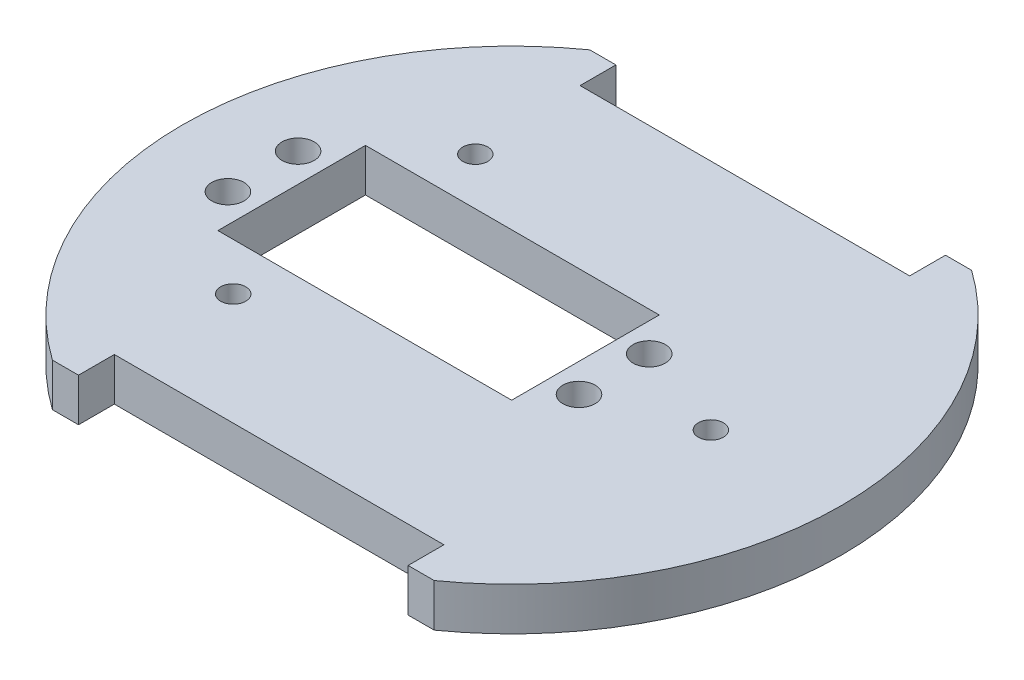
ISO-10303-21;
HEADER;
FILE_DESCRIPTION(('STEP AP214'),'2;1');
FILE_NAME('part.step','',(''),(''),'','','');
FILE_SCHEMA(('AUTOMOTIVE_DESIGN { 1 0 10303 214 1 1 1 1 }'));
ENDSEC;
DATA;
#1=APPLICATION_CONTEXT('core data for automotive mechanical design processes');
#2=APPLICATION_PROTOCOL_DEFINITION('international standard','automotive_design',2000,#1);
#3=PRODUCT_CONTEXT('',#1,'mechanical');
#4=PRODUCT('Part','Part','',(#3));
#5=PRODUCT_RELATED_PRODUCT_CATEGORY('part','',(#4));
#6=PRODUCT_DEFINITION_FORMATION('','',#4);
#7=PRODUCT_DEFINITION_CONTEXT('part definition',#1,'design');
#8=PRODUCT_DEFINITION('design','',#6,#7);
#9=PRODUCT_DEFINITION_SHAPE('','',#8);
#10=(LENGTH_UNIT() NAMED_UNIT(*) SI_UNIT(.MILLI.,.METRE.));
#11=(NAMED_UNIT(*) PLANE_ANGLE_UNIT() SI_UNIT($,.RADIAN.));
#12=(NAMED_UNIT(*) SI_UNIT($,.STERADIAN.) SOLID_ANGLE_UNIT());
#13=UNCERTAINTY_MEASURE_WITH_UNIT(LENGTH_MEASURE(1.E-05),#10,'distance_accuracy_value','');
#14=(GEOMETRIC_REPRESENTATION_CONTEXT(3) GLOBAL_UNCERTAINTY_ASSIGNED_CONTEXT((#13)) GLOBAL_UNIT_ASSIGNED_CONTEXT((#10,
#11,#12)) REPRESENTATION_CONTEXT('',''));
#15=CARTESIAN_POINT('',(0.,0.,0.));
#16=DIRECTION('',(0.,0.,1.));
#17=DIRECTION('',(1.,0.,0.));
#18=AXIS2_PLACEMENT_3D('',#15,#16,#17);
#19=CARTESIAN_POINT('',(0.,6.,0.));
#20=DIRECTION('',(0.,1.,0.));
#21=DIRECTION('',(0.,0.,1.));
#22=AXIS2_PLACEMENT_3D('',#19,#20,#21);
#23=PLANE('',#22);
#24=CARTESIAN_POINT('',(-34.75,6.,4.9));
#25=DIRECTION('',(0.,1.,0.));
#26=DIRECTION('',(0.,0.,-1.));
#27=AXIS2_PLACEMENT_3D('',#24,#25,#26);
#28=CIRCLE('',#27,2.25);
#29=CARTESIAN_POINT('',(-34.75,6.,2.65));
#30=VERTEX_POINT('',#29);
#31=EDGE_CURVE('E555',#30,#30,#28,.T.);
#32=ORIENTED_EDGE('',*,*,#31,.F.);
#33=EDGE_LOOP('',(#32));
#34=FACE_BOUND('',#33,.T.);
#35=CARTESIAN_POINT('',(-22.0155551930817,6.,-16.893129654992));
#36=DIRECTION('',(0.,1.,0.));
#37=DIRECTION('',(0.,0.,1.));
#38=AXIS2_PLACEMENT_3D('',#35,#36,#37);
#39=CIRCLE('',#38,1.75);
#40=CARTESIAN_POINT('',(-22.0155551930817,6.,-15.143129654992));
#41=VERTEX_POINT('',#40);
#42=EDGE_CURVE('E567',#41,#41,#39,.T.);
#43=ORIENTED_EDGE('',*,*,#42,.F.);
#44=EDGE_LOOP('',(#43));
#45=FACE_BOUND('',#44,.T.);
#46=CARTESIAN_POINT('',(14.25,6.,4.9));
#47=DIRECTION('',(0.,1.,0.));
#48=DIRECTION('',(0.,0.,1.));
#49=AXIS2_PLACEMENT_3D('',#46,#47,#48);
#50=CIRCLE('',#49,2.25);
#51=CARTESIAN_POINT('',(14.25,6.,7.15));
#52=VERTEX_POINT('',#51);
#53=EDGE_CURVE('E579',#52,#52,#50,.T.);
#54=ORIENTED_EDGE('',*,*,#53,.F.);
#55=EDGE_LOOP('',(#54));
#56=FACE_BOUND('',#55,.T.);
#57=DIRECTION('',(-1.,0.,0.));
#58=VECTOR('',#57,1.);
#59=CARTESIAN_POINT('',(-30.75,6.,-10.3));
#60=LINE('',#59,#58);
#61=CARTESIAN_POINT('',(10.25,6.,-10.3));
#62=VERTEX_POINT('',#61);
#63=CARTESIAN_POINT('',(-30.75,6.,-10.3));
#64=VERTEX_POINT('',#63);
#65=EDGE_CURVE('E154',#62,#64,#60,.T.);
#66=ORIENTED_EDGE('',*,*,#65,.F.);
#67=DIRECTION('',(0.,0.,-1.));
#68=VECTOR('',#67,1.);
#69=CARTESIAN_POINT('',(10.25,6.,10.3));
#70=LINE('',#69,#68);
#71=CARTESIAN_POINT('',(10.25,6.,10.3));
#72=VERTEX_POINT('',#71);
#73=EDGE_CURVE('E146',#72,#62,#70,.T.);
#74=ORIENTED_EDGE('',*,*,#73,.F.);
#75=DIRECTION('',(1.,0.,0.));
#76=VECTOR('',#75,1.);
#77=CARTESIAN_POINT('',(-30.75,6.,10.3));
#78=LINE('',#77,#76);
#79=CARTESIAN_POINT('',(-30.75,6.,10.3));
#80=VERTEX_POINT('',#79);
#81=EDGE_CURVE('E169',#80,#72,#78,.T.);
#82=ORIENTED_EDGE('',*,*,#81,.F.);
#83=DIRECTION('',(0.,0.,1.));
#84=VECTOR('',#83,1.);
#85=CARTESIAN_POINT('',(-30.75,6.,10.3));
#86=LINE('',#85,#84);
#87=EDGE_CURVE('E167',#64,#80,#86,.T.);
#88=ORIENTED_EDGE('',*,*,#87,.F.);
#89=EDGE_LOOP('',(#66,#74,#82,#88));
#90=FACE_BOUND('',#89,.T.);
#91=DIRECTION('',(-1.94289029309378E-13,0.,1.));
#92=VECTOR('',#91,1.);
#93=CARTESIAN_POINT('',(23.0000000000005,6.,32.4999999999997));
#94=LINE('',#93,#92);
#95=CARTESIAN_POINT('',(23.0000000000005,6.,32.4999999999997));
#96=VERTEX_POINT('',#95);
#97=CARTESIAN_POINT('',(22.9999999999995,6.,37.5000000000003));
#98=VERTEX_POINT('',#97);
#99=EDGE_CURVE('E185',#96,#98,#94,.T.);
#100=ORIENTED_EDGE('',*,*,#99,.T.);
#101=DIRECTION('',(1.,0.,0.));
#102=VECTOR('',#101,1.);
#103=CARTESIAN_POINT('',(22.9999999999995,6.,37.5000000000003));
#104=LINE('',#103,#102);
#105=CARTESIAN_POINT('',(26.6411336095139,6.,37.5000000000004));
#106=VERTEX_POINT('',#105);
#107=EDGE_CURVE('E188',#98,#106,#104,.T.);
#108=ORIENTED_EDGE('',*,*,#107,.T.);
#109=CARTESIAN_POINT('',(0.,6.,0.));
#110=DIRECTION('',(0.,1.,0.));
#111=DIRECTION('',(0.,0.,1.));
#112=AXIS2_PLACEMENT_3D('',#109,#110,#111);
#113=CIRCLE('',#112,46.);
#114=CARTESIAN_POINT('',(26.6411336095145,6.,-37.5));
#115=VERTEX_POINT('',#114);
#116=EDGE_CURVE('E191',#106,#115,#113,.T.);
#117=ORIENTED_EDGE('',*,*,#116,.T.);
#118=DIRECTION('',(-1.,0.,0.));
#119=VECTOR('',#118,1.);
#120=CARTESIAN_POINT('',(23.,6.,-37.5));
#121=LINE('',#120,#119);
#122=CARTESIAN_POINT('',(23.,6.,-37.5));
#123=VERTEX_POINT('',#122);
#124=EDGE_CURVE('E193',#115,#123,#121,.T.);
#125=ORIENTED_EDGE('',*,*,#124,.T.);
#126=DIRECTION('',(0.,0.,1.));
#127=VECTOR('',#126,1.);
#128=CARTESIAN_POINT('',(23.,6.,-32.5));
#129=LINE('',#128,#127);
#130=CARTESIAN_POINT('',(23.,6.,-32.5));
#131=VERTEX_POINT('',#130);
#132=EDGE_CURVE('E195',#123,#131,#129,.T.);
#133=ORIENTED_EDGE('',*,*,#132,.T.);
#134=DIRECTION('',(-1.,0.,0.));
#135=VECTOR('',#134,1.);
#136=CARTESIAN_POINT('',(-23.,6.,-32.5));
#137=LINE('',#136,#135);
#138=CARTESIAN_POINT('',(-23.,6.,-32.5));
#139=VERTEX_POINT('',#138);
#140=EDGE_CURVE('E197',#131,#139,#137,.T.);
#141=ORIENTED_EDGE('',*,*,#140,.T.);
#142=DIRECTION('',(0.,0.,-1.));
#143=VECTOR('',#142,1.);
#144=CARTESIAN_POINT('',(-23.,6.,-32.5));
#145=LINE('',#144,#143);
#146=CARTESIAN_POINT('',(-23.,6.,-37.5));
#147=VERTEX_POINT('',#146);
#148=EDGE_CURVE('E199',#139,#147,#145,.T.);
#149=ORIENTED_EDGE('',*,*,#148,.T.);
#150=DIRECTION('',(-1.,0.,0.));
#151=VECTOR('',#150,1.);
#152=CARTESIAN_POINT('',(-26.6411336095145,6.,-37.5));
#153=LINE('',#152,#151);
#154=CARTESIAN_POINT('',(-26.6411336095145,6.,-37.5));
#155=VERTEX_POINT('',#154);
#156=EDGE_CURVE('E201',#147,#155,#153,.T.);
#157=ORIENTED_EDGE('',*,*,#156,.T.);
#158=CARTESIAN_POINT('',(0.,6.,0.));
#159=DIRECTION('',(0.,1.,0.));
#160=DIRECTION('',(0.,0.,1.));
#161=AXIS2_PLACEMENT_3D('',#158,#159,#160);
#162=CIRCLE('',#161,46.);
#163=CARTESIAN_POINT('',(-26.641133609514,6.,37.5000000000003));
#164=VERTEX_POINT('',#163);
#165=EDGE_CURVE('E203',#155,#164,#162,.T.);
#166=ORIENTED_EDGE('',*,*,#165,.T.);
#167=DIRECTION('',(1.,0.,0.));
#168=VECTOR('',#167,1.);
#169=CARTESIAN_POINT('',(-26.6411336095139,6.,37.5000000000004));
#170=LINE('',#169,#168);
#171=CARTESIAN_POINT('',(-22.9999999999995,6.,37.5000000000003));
#172=VERTEX_POINT('',#171);
#173=EDGE_CURVE('E205',#164,#172,#170,.T.);
#174=ORIENTED_EDGE('',*,*,#173,.T.);
#175=DIRECTION('',(0.,0.,-1.));
#176=VECTOR('',#175,1.);
#177=CARTESIAN_POINT('',(-22.9999999999995,6.,32.5000000000003));
#178=LINE('',#177,#176);
#179=CARTESIAN_POINT('',(-22.9999999999995,6.,32.5000000000003));
#180=VERTEX_POINT('',#179);
#181=EDGE_CURVE('E207',#172,#180,#178,.T.);
#182=ORIENTED_EDGE('',*,*,#181,.T.);
#183=DIRECTION('',(1.,0.,0.));
#184=VECTOR('',#183,1.);
#185=CARTESIAN_POINT('',(-22.9999999999995,6.,32.5000000000003));
#186=LINE('',#185,#184);
#187=EDGE_CURVE('E209',#180,#96,#186,.T.);
#188=ORIENTED_EDGE('',*,*,#187,.T.);
#189=EDGE_LOOP('',(#100,#108,#117,#125,#133,#141,#149,#157,#166,#174,#182,#188));
#190=FACE_BOUND('',#189,.T.);
#191=CARTESIAN_POINT('',(14.25,6.,-4.9));
#192=DIRECTION('',(0.,1.,0.));
#193=DIRECTION('',(0.,0.,1.));
#194=AXIS2_PLACEMENT_3D('',#191,#192,#193);
#195=CIRCLE('',#194,2.25);
#196=CARTESIAN_POINT('',(14.25,6.,-2.65));
#197=VERTEX_POINT('',#196);
#198=EDGE_CURVE('E175',#197,#197,#195,.T.);
#199=ORIENTED_EDGE('',*,*,#198,.F.);
#200=EDGE_LOOP('',(#199));
#201=FACE_BOUND('',#200,.T.);
#202=CARTESIAN_POINT('',(27.75,6.,0.));
#203=DIRECTION('',(0.,1.,0.));
#204=DIRECTION('',(0.,0.,1.));
#205=AXIS2_PLACEMENT_3D('',#202,#203,#204);
#206=CIRCLE('',#205,1.75);
#207=CARTESIAN_POINT('',(27.75,6.,1.75));
#208=VERTEX_POINT('',#207);
#209=EDGE_CURVE('E573',#208,#208,#206,.T.);
#210=ORIENTED_EDGE('',*,*,#209,.F.);
#211=EDGE_LOOP('',(#210));
#212=FACE_BOUND('',#211,.T.);
#213=CARTESIAN_POINT('',(-34.75,6.,-4.9));
#214=DIRECTION('',(0.,1.,0.));
#215=DIRECTION('',(0.,0.,-1.));
#216=AXIS2_PLACEMENT_3D('',#213,#214,#215);
#217=CIRCLE('',#216,2.25);
#218=CARTESIAN_POINT('',(-34.75,6.,-7.15));
#219=VERTEX_POINT('',#218);
#220=EDGE_CURVE('E561',#219,#219,#217,.T.);
#221=ORIENTED_EDGE('',*,*,#220,.F.);
#222=EDGE_LOOP('',(#221));
#223=FACE_BOUND('',#222,.T.);
#224=CARTESIAN_POINT('',(-22.0155551930818,6.,16.893129654992));
#225=DIRECTION('',(0.,1.,0.));
#226=DIRECTION('',(0.,0.,1.));
#227=AXIS2_PLACEMENT_3D('',#224,#225,#226);
#228=CIRCLE('',#227,1.75);
#229=CARTESIAN_POINT('',(-22.0155551930818,6.,18.643129654992));
#230=VERTEX_POINT('',#229);
#231=EDGE_CURVE('E546',#230,#230,#228,.T.);
#232=ORIENTED_EDGE('',*,*,#231,.F.);
#233=EDGE_LOOP('',(#232));
#234=FACE_BOUND('',#233,.T.);
#235=ADVANCED_FACE('F33',(#34,#45,#56,#90,#190,#201,#212,#223,#234),#23,.T.);
#236=CARTESIAN_POINT('',(0.,0.,0.));
#237=DIRECTION('',(0.,1.,0.));
#238=DIRECTION('',(0.,0.,1.));
#239=AXIS2_PLACEMENT_3D('',#236,#237,#238);
#240=PLANE('',#239);
#241=DIRECTION('',(-1.94289029309378E-13,0.,1.));
#242=VECTOR('',#241,1.);
#243=CARTESIAN_POINT('',(23.0000000000005,0.,32.4999999999997));
#244=LINE('',#243,#242);
#245=CARTESIAN_POINT('',(23.0000000000005,0.,32.4999999999997));
#246=VERTEX_POINT('',#245);
#247=CARTESIAN_POINT('',(22.9999999999995,0.,37.5000000000003));
#248=VERTEX_POINT('',#247);
#249=EDGE_CURVE('E162',#246,#248,#244,.T.);
#250=ORIENTED_EDGE('',*,*,#249,.F.);
#251=DIRECTION('',(1.,0.,0.));
#252=VECTOR('',#251,1.);
#253=CARTESIAN_POINT('',(-22.9999999999995,0.,32.5000000000003));
#254=LINE('',#253,#252);
#255=CARTESIAN_POINT('',(-22.9999999999995,0.,32.5000000000003));
#256=VERTEX_POINT('',#255);
#257=EDGE_CURVE('E189',#256,#246,#254,.T.);
#258=ORIENTED_EDGE('',*,*,#257,.F.);
#259=DIRECTION('',(0.,0.,-1.));
#260=VECTOR('',#259,1.);
#261=CARTESIAN_POINT('',(-22.9999999999995,0.,32.5000000000003));
#262=LINE('',#261,#260);
#263=CARTESIAN_POINT('',(-22.9999999999995,0.,37.5000000000003));
#264=VERTEX_POINT('',#263);
#265=EDGE_CURVE('E232',#264,#256,#262,.T.);
#266=ORIENTED_EDGE('',*,*,#265,.F.);
#267=DIRECTION('',(1.,0.,0.));
#268=VECTOR('',#267,1.);
#269=CARTESIAN_POINT('',(-26.6411336095139,0.,37.5000000000004));
#270=LINE('',#269,#268);
#271=CARTESIAN_POINT('',(-26.641133609514,0.,37.5000000000003));
#272=VERTEX_POINT('',#271);
#273=EDGE_CURVE('E230',#272,#264,#270,.T.);
#274=ORIENTED_EDGE('',*,*,#273,.F.);
#275=CARTESIAN_POINT('',(0.,0.,0.));
#276=DIRECTION('',(0.,1.,0.));
#277=DIRECTION('',(0.,0.,1.));
#278=AXIS2_PLACEMENT_3D('',#275,#276,#277);
#279=CIRCLE('',#278,46.);
#280=CARTESIAN_POINT('',(-26.6411336095145,0.,-37.5));
#281=VERTEX_POINT('',#280);
#282=EDGE_CURVE('E228',#281,#272,#279,.T.);
#283=ORIENTED_EDGE('',*,*,#282,.F.);
#284=DIRECTION('',(-1.,0.,0.));
#285=VECTOR('',#284,1.);
#286=CARTESIAN_POINT('',(-26.6411336095145,0.,-37.5));
#287=LINE('',#286,#285);
#288=CARTESIAN_POINT('',(-23.,0.,-37.5));
#289=VERTEX_POINT('',#288);
#290=EDGE_CURVE('E226',#289,#281,#287,.T.);
#291=ORIENTED_EDGE('',*,*,#290,.F.);
#292=DIRECTION('',(0.,0.,-1.));
#293=VECTOR('',#292,1.);
#294=CARTESIAN_POINT('',(-23.,0.,-32.5));
#295=LINE('',#294,#293);
#296=CARTESIAN_POINT('',(-23.,0.,-32.5));
#297=VERTEX_POINT('',#296);
#298=EDGE_CURVE('E224',#297,#289,#295,.T.);
#299=ORIENTED_EDGE('',*,*,#298,.F.);
#300=DIRECTION('',(-1.,0.,0.));
#301=VECTOR('',#300,1.);
#302=CARTESIAN_POINT('',(-23.,0.,-32.5));
#303=LINE('',#302,#301);
#304=CARTESIAN_POINT('',(23.,0.,-32.5));
#305=VERTEX_POINT('',#304);
#306=EDGE_CURVE('E222',#305,#297,#303,.T.);
#307=ORIENTED_EDGE('',*,*,#306,.F.);
#308=DIRECTION('',(0.,0.,1.));
#309=VECTOR('',#308,1.);
#310=CARTESIAN_POINT('',(23.,0.,-32.5));
#311=LINE('',#310,#309);
#312=CARTESIAN_POINT('',(23.,0.,-37.5));
#313=VERTEX_POINT('',#312);
#314=EDGE_CURVE('E220',#313,#305,#311,.T.);
#315=ORIENTED_EDGE('',*,*,#314,.F.);
#316=DIRECTION('',(-1.,0.,0.));
#317=VECTOR('',#316,1.);
#318=CARTESIAN_POINT('',(23.,0.,-37.5));
#319=LINE('',#318,#317);
#320=CARTESIAN_POINT('',(26.6411336095145,0.,-37.5));
#321=VERTEX_POINT('',#320);
#322=EDGE_CURVE('E218',#321,#313,#319,.T.);
#323=ORIENTED_EDGE('',*,*,#322,.F.);
#324=CARTESIAN_POINT('',(0.,0.,0.));
#325=DIRECTION('',(0.,1.,0.));
#326=DIRECTION('',(0.,0.,1.));
#327=AXIS2_PLACEMENT_3D('',#324,#325,#326);
#328=CIRCLE('',#327,46.);
#329=CARTESIAN_POINT('',(26.6411336095139,0.,37.5000000000004));
#330=VERTEX_POINT('',#329);
#331=EDGE_CURVE('E216',#330,#321,#328,.T.);
#332=ORIENTED_EDGE('',*,*,#331,.F.);
#333=DIRECTION('',(1.,0.,0.));
#334=VECTOR('',#333,1.);
#335=CARTESIAN_POINT('',(22.9999999999995,0.,37.5000000000003));
#336=LINE('',#335,#334);
#337=EDGE_CURVE('E214',#248,#330,#336,.T.);
#338=ORIENTED_EDGE('',*,*,#337,.F.);
#339=EDGE_LOOP('',(#250,#258,#266,#274,#283,#291,#299,#307,#315,#323,#332,#338));
#340=FACE_BOUND('',#339,.T.);
#341=DIRECTION('',(0.,0.,-1.));
#342=VECTOR('',#341,1.);
#343=CARTESIAN_POINT('',(10.25,0.,10.3));
#344=LINE('',#343,#342);
#345=CARTESIAN_POINT('',(10.25,0.,10.3));
#346=VERTEX_POINT('',#345);
#347=CARTESIAN_POINT('',(10.25,0.,-10.3));
#348=VERTEX_POINT('',#347);
#349=EDGE_CURVE('E56',#346,#348,#344,.T.);
#350=ORIENTED_EDGE('',*,*,#349,.T.);
#351=DIRECTION('',(-1.,0.,0.));
#352=VECTOR('',#351,1.);
#353=CARTESIAN_POINT('',(-30.75,0.,-10.3));
#354=LINE('',#353,#352);
#355=CARTESIAN_POINT('',(-30.75,0.,-10.3));
#356=VERTEX_POINT('',#355);
#357=EDGE_CURVE('E161',#348,#356,#354,.T.);
#358=ORIENTED_EDGE('',*,*,#357,.T.);
#359=DIRECTION('',(0.,0.,1.));
#360=VECTOR('',#359,1.);
#361=CARTESIAN_POINT('',(-30.75,0.,10.3));
#362=LINE('',#361,#360);
#363=CARTESIAN_POINT('',(-30.75,0.,10.3));
#364=VERTEX_POINT('',#363);
#365=EDGE_CURVE('E177',#356,#364,#362,.T.);
#366=ORIENTED_EDGE('',*,*,#365,.T.);
#367=DIRECTION('',(1.,0.,0.));
#368=VECTOR('',#367,1.);
#369=CARTESIAN_POINT('',(-30.75,0.,10.3));
#370=LINE('',#369,#368);
#371=EDGE_CURVE('E155',#364,#346,#370,.T.);
#372=ORIENTED_EDGE('',*,*,#371,.T.);
#373=EDGE_LOOP('',(#350,#358,#366,#372));
#374=FACE_BOUND('',#373,.T.);
#375=CARTESIAN_POINT('',(14.25,0.,-4.9));
#376=DIRECTION('',(0.,1.,0.));
#377=DIRECTION('',(0.,0.,1.));
#378=AXIS2_PLACEMENT_3D('',#375,#376,#377);
#379=CIRCLE('',#378,2.25);
#380=CARTESIAN_POINT('',(14.25,0.,-2.65));
#381=VERTEX_POINT('',#380);
#382=EDGE_CURVE('E582',#381,#381,#379,.T.);
#383=ORIENTED_EDGE('',*,*,#382,.T.);
#384=EDGE_LOOP('',(#383));
#385=FACE_BOUND('',#384,.T.);
#386=CARTESIAN_POINT('',(14.25,0.,4.9));
#387=DIRECTION('',(0.,1.,0.));
#388=DIRECTION('',(0.,0.,1.));
#389=AXIS2_PLACEMENT_3D('',#386,#387,#388);
#390=CIRCLE('',#389,2.25);
#391=CARTESIAN_POINT('',(14.25,0.,7.15));
#392=VERTEX_POINT('',#391);
#393=EDGE_CURVE('E576',#392,#392,#390,.T.);
#394=ORIENTED_EDGE('',*,*,#393,.T.);
#395=EDGE_LOOP('',(#394));
#396=FACE_BOUND('',#395,.T.);
#397=CARTESIAN_POINT('',(27.75,0.,0.));
#398=DIRECTION('',(0.,1.,0.));
#399=DIRECTION('',(0.,0.,1.));
#400=AXIS2_PLACEMENT_3D('',#397,#398,#399);
#401=CIRCLE('',#400,1.75);
#402=CARTESIAN_POINT('',(27.75,0.,1.75));
#403=VERTEX_POINT('',#402);
#404=EDGE_CURVE('E570',#403,#403,#401,.T.);
#405=ORIENTED_EDGE('',*,*,#404,.T.);
#406=EDGE_LOOP('',(#405));
#407=FACE_BOUND('',#406,.T.);
#408=CARTESIAN_POINT('',(-22.0155551930817,0.,-16.893129654992));
#409=DIRECTION('',(0.,1.,0.));
#410=DIRECTION('',(0.,0.,1.));
#411=AXIS2_PLACEMENT_3D('',#408,#409,#410);
#412=CIRCLE('',#411,1.75);
#413=CARTESIAN_POINT('',(-22.0155551930817,0.,-15.143129654992));
#414=VERTEX_POINT('',#413);
#415=EDGE_CURVE('E564',#414,#414,#412,.T.);
#416=ORIENTED_EDGE('',*,*,#415,.T.);
#417=EDGE_LOOP('',(#416));
#418=FACE_BOUND('',#417,.T.);
#419=CARTESIAN_POINT('',(-34.75,0.,-4.9));
#420=DIRECTION('',(0.,1.,0.));
#421=DIRECTION('',(0.,0.,-1.));
#422=AXIS2_PLACEMENT_3D('',#419,#420,#421);
#423=CIRCLE('',#422,2.25);
#424=CARTESIAN_POINT('',(-34.75,0.,-7.15));
#425=VERTEX_POINT('',#424);
#426=EDGE_CURVE('E558',#425,#425,#423,.T.);
#427=ORIENTED_EDGE('',*,*,#426,.T.);
#428=EDGE_LOOP('',(#427));
#429=FACE_BOUND('',#428,.T.);
#430=CARTESIAN_POINT('',(-34.75,0.,4.9));
#431=DIRECTION('',(0.,1.,0.));
#432=DIRECTION('',(0.,0.,-1.));
#433=AXIS2_PLACEMENT_3D('',#430,#431,#432);
#434=CIRCLE('',#433,2.25);
#435=CARTESIAN_POINT('',(-34.75,0.,2.65));
#436=VERTEX_POINT('',#435);
#437=EDGE_CURVE('E552',#436,#436,#434,.T.);
#438=ORIENTED_EDGE('',*,*,#437,.T.);
#439=EDGE_LOOP('',(#438));
#440=FACE_BOUND('',#439,.T.);
#441=CARTESIAN_POINT('',(-22.0155551930818,0.,16.893129654992));
#442=DIRECTION('',(0.,1.,0.));
#443=DIRECTION('',(0.,0.,1.));
#444=AXIS2_PLACEMENT_3D('',#441,#442,#443);
#445=CIRCLE('',#444,1.75);
#446=CARTESIAN_POINT('',(-22.0155551930818,0.,18.643129654992));
#447=VERTEX_POINT('',#446);
#448=EDGE_CURVE('E549',#447,#447,#445,.T.);
#449=ORIENTED_EDGE('',*,*,#448,.T.);
#450=EDGE_LOOP('',(#449));
#451=FACE_BOUND('',#450,.T.);
#452=ADVANCED_FACE('F274',(#340,#374,#385,#396,#407,#418,#429,#440,#451),#240,.F.);
#453=CARTESIAN_POINT('',(23.0000000000005,6.,32.4999999999997));
#454=DIRECTION('',(1.,0.,1.94289029309378E-13));
#455=DIRECTION('',(1.94289029309378E-13,0.,-1.));
#456=AXIS2_PLACEMENT_3D('',#453,#454,#455);
#457=PLANE('',#456);
#458=ORIENTED_EDGE('',*,*,#249,.T.);
#459=DIRECTION('',(0.,-1.,0.));
#460=VECTOR('',#459,1.);
#461=CARTESIAN_POINT('',(22.9999999999995,6.,37.5000000000003));
#462=LINE('',#461,#460);
#463=EDGE_CURVE('E11',#98,#248,#462,.T.);
#464=ORIENTED_EDGE('',*,*,#463,.F.);
#465=ORIENTED_EDGE('',*,*,#99,.F.);
#466=DIRECTION('',(0.,-1.,0.));
#467=VECTOR('',#466,1.);
#468=CARTESIAN_POINT('',(23.0000000000005,6.,32.4999999999997));
#469=LINE('',#468,#467);
#470=EDGE_CURVE('E211',#96,#246,#469,.T.);
#471=ORIENTED_EDGE('',*,*,#470,.T.);
#472=EDGE_LOOP('',(#458,#464,#465,#471));
#473=FACE_BOUND('',#472,.T.);
#474=ADVANCED_FACE('F35',(#473),#457,.F.);
#475=CARTESIAN_POINT('',(22.9999999999995,6.,37.5000000000003));
#476=DIRECTION('',(0.,0.,-1.));
#477=DIRECTION('',(-1.,0.,0.));
#478=AXIS2_PLACEMENT_3D('',#475,#476,#477);
#479=PLANE('',#478);
#480=ORIENTED_EDGE('',*,*,#337,.T.);
#481=DIRECTION('',(0.,-1.,0.));
#482=VECTOR('',#481,1.);
#483=CARTESIAN_POINT('',(26.6411336095139,6.,37.5000000000004));
#484=LINE('',#483,#482);
#485=EDGE_CURVE('E41',#106,#330,#484,.T.);
#486=ORIENTED_EDGE('',*,*,#485,.F.);
#487=ORIENTED_EDGE('',*,*,#107,.F.);
#488=ORIENTED_EDGE('',*,*,#463,.T.);
#489=EDGE_LOOP('',(#480,#486,#487,#488));
#490=FACE_BOUND('',#489,.T.);
#491=ADVANCED_FACE('F291',(#490),#479,.F.);
#492=CARTESIAN_POINT('',(0.,6.,0.));
#493=DIRECTION('',(0.,-1.,0.));
#494=DIRECTION('',(0.,0.,-1.));
#495=AXIS2_PLACEMENT_3D('',#492,#493,#494);
#496=CYLINDRICAL_SURFACE('',#495,46.);
#497=ORIENTED_EDGE('',*,*,#331,.T.);
#498=DIRECTION('',(0.,-1.,0.));
#499=VECTOR('',#498,1.);
#500=CARTESIAN_POINT('',(26.6411336095145,6.,-37.5));
#501=LINE('',#500,#499);
#502=EDGE_CURVE('E261',#115,#321,#501,.T.);
#503=ORIENTED_EDGE('',*,*,#502,.F.);
#504=ORIENTED_EDGE('',*,*,#116,.F.);
#505=ORIENTED_EDGE('',*,*,#485,.T.);
#506=EDGE_LOOP('',(#497,#503,#504,#505));
#507=FACE_BOUND('',#506,.T.);
#508=ADVANCED_FACE('F268',(#507),#496,.T.);
#509=CARTESIAN_POINT('',(23.,6.,-37.5));
#510=DIRECTION('',(0.,0.,1.));
#511=DIRECTION('',(1.,0.,0.));
#512=AXIS2_PLACEMENT_3D('',#509,#510,#511);
#513=PLANE('',#512);
#514=ORIENTED_EDGE('',*,*,#322,.T.);
#515=DIRECTION('',(0.,-1.,0.));
#516=VECTOR('',#515,1.);
#517=CARTESIAN_POINT('',(23.,6.,-37.5));
#518=LINE('',#517,#516);
#519=EDGE_CURVE('E258',#123,#313,#518,.T.);
#520=ORIENTED_EDGE('',*,*,#519,.F.);
#521=ORIENTED_EDGE('',*,*,#124,.F.);
#522=ORIENTED_EDGE('',*,*,#502,.T.);
#523=EDGE_LOOP('',(#514,#520,#521,#522));
#524=FACE_BOUND('',#523,.T.);
#525=ADVANCED_FACE('F280',(#524),#513,.F.);
#526=CARTESIAN_POINT('',(23.,6.,-32.5));
#527=DIRECTION('',(1.,0.,0.));
#528=DIRECTION('',(0.,0.,-1.));
#529=AXIS2_PLACEMENT_3D('',#526,#527,#528);
#530=PLANE('',#529);
#531=ORIENTED_EDGE('',*,*,#314,.T.);
#532=DIRECTION('',(0.,-1.,0.));
#533=VECTOR('',#532,1.);
#534=CARTESIAN_POINT('',(23.,6.,-32.5));
#535=LINE('',#534,#533);
#536=EDGE_CURVE('E255',#131,#305,#535,.T.);
#537=ORIENTED_EDGE('',*,*,#536,.F.);
#538=ORIENTED_EDGE('',*,*,#132,.F.);
#539=ORIENTED_EDGE('',*,*,#519,.T.);
#540=EDGE_LOOP('',(#531,#537,#538,#539));
#541=FACE_BOUND('',#540,.T.);
#542=ADVANCED_FACE('F284',(#541),#530,.F.);
#543=CARTESIAN_POINT('',(-23.,6.,-32.5));
#544=DIRECTION('',(0.,0.,1.));
#545=DIRECTION('',(1.,0.,0.));
#546=AXIS2_PLACEMENT_3D('',#543,#544,#545);
#547=PLANE('',#546);
#548=ORIENTED_EDGE('',*,*,#306,.T.);
#549=DIRECTION('',(0.,-1.,0.));
#550=VECTOR('',#549,1.);
#551=CARTESIAN_POINT('',(-23.,6.,-32.5));
#552=LINE('',#551,#550);
#553=EDGE_CURVE('E252',#139,#297,#552,.T.);
#554=ORIENTED_EDGE('',*,*,#553,.F.);
#555=ORIENTED_EDGE('',*,*,#140,.F.);
#556=ORIENTED_EDGE('',*,*,#536,.T.);
#557=EDGE_LOOP('',(#548,#554,#555,#556));
#558=FACE_BOUND('',#557,.T.);
#559=ADVANCED_FACE('F324',(#558),#547,.F.);
#560=CARTESIAN_POINT('',(-23.,6.,-32.5));
#561=DIRECTION('',(-1.,0.,0.));
#562=DIRECTION('',(0.,0.,1.));
#563=AXIS2_PLACEMENT_3D('',#560,#561,#562);
#564=PLANE('',#563);
#565=ORIENTED_EDGE('',*,*,#298,.T.);
#566=DIRECTION('',(0.,-1.,0.));
#567=VECTOR('',#566,1.);
#568=CARTESIAN_POINT('',(-23.,6.,-37.5));
#569=LINE('',#568,#567);
#570=EDGE_CURVE('E249',#147,#289,#569,.T.);
#571=ORIENTED_EDGE('',*,*,#570,.F.);
#572=ORIENTED_EDGE('',*,*,#148,.F.);
#573=ORIENTED_EDGE('',*,*,#553,.T.);
#574=EDGE_LOOP('',(#565,#571,#572,#573));
#575=FACE_BOUND('',#574,.T.);
#576=ADVANCED_FACE('F322',(#575),#564,.F.);
#577=CARTESIAN_POINT('',(-26.6411336095145,6.,-37.5));
#578=DIRECTION('',(0.,0.,1.));
#579=DIRECTION('',(1.,0.,0.));
#580=AXIS2_PLACEMENT_3D('',#577,#578,#579);
#581=PLANE('',#580);
#582=ORIENTED_EDGE('',*,*,#290,.T.);
#583=DIRECTION('',(0.,-1.,0.));
#584=VECTOR('',#583,1.);
#585=CARTESIAN_POINT('',(-26.6411336095145,6.,-37.5));
#586=LINE('',#585,#584);
#587=EDGE_CURVE('E246',#155,#281,#586,.T.);
#588=ORIENTED_EDGE('',*,*,#587,.F.);
#589=ORIENTED_EDGE('',*,*,#156,.F.);
#590=ORIENTED_EDGE('',*,*,#570,.T.);
#591=EDGE_LOOP('',(#582,#588,#589,#590));
#592=FACE_BOUND('',#591,.T.);
#593=ADVANCED_FACE('F318',(#592),#581,.F.);
#594=CARTESIAN_POINT('',(0.,6.,0.));
#595=DIRECTION('',(0.,-1.,0.));
#596=DIRECTION('',(0.,0.,-1.));
#597=AXIS2_PLACEMENT_3D('',#594,#595,#596);
#598=CYLINDRICAL_SURFACE('',#597,46.);
#599=ORIENTED_EDGE('',*,*,#282,.T.);
#600=DIRECTION('',(0.,-1.,0.));
#601=VECTOR('',#600,1.);
#602=CARTESIAN_POINT('',(-26.641133609514,6.,37.5000000000003));
#603=LINE('',#602,#601);
#604=EDGE_CURVE('E243',#164,#272,#603,.T.);
#605=ORIENTED_EDGE('',*,*,#604,.F.);
#606=ORIENTED_EDGE('',*,*,#165,.F.);
#607=ORIENTED_EDGE('',*,*,#587,.T.);
#608=EDGE_LOOP('',(#599,#605,#606,#607));
#609=FACE_BOUND('',#608,.T.);
#610=ADVANCED_FACE('F313',(#609),#598,.T.);
#611=CARTESIAN_POINT('',(-26.6411336095139,6.,37.5000000000004));
#612=DIRECTION('',(0.,0.,-1.));
#613=DIRECTION('',(-1.,0.,0.));
#614=AXIS2_PLACEMENT_3D('',#611,#612,#613);
#615=PLANE('',#614);
#616=ORIENTED_EDGE('',*,*,#273,.T.);
#617=DIRECTION('',(0.,-1.,0.));
#618=VECTOR('',#617,1.);
#619=CARTESIAN_POINT('',(-22.9999999999995,6.,37.5000000000003));
#620=LINE('',#619,#618);
#621=EDGE_CURVE('E240',#172,#264,#620,.T.);
#622=ORIENTED_EDGE('',*,*,#621,.F.);
#623=ORIENTED_EDGE('',*,*,#173,.F.);
#624=ORIENTED_EDGE('',*,*,#604,.T.);
#625=EDGE_LOOP('',(#616,#622,#623,#624));
#626=FACE_BOUND('',#625,.T.);
#627=ADVANCED_FACE('F307',(#626),#615,.F.);
#628=CARTESIAN_POINT('',(-22.9999999999995,6.,32.5000000000003));
#629=DIRECTION('',(-1.,0.,0.));
#630=DIRECTION('',(0.,0.,1.));
#631=AXIS2_PLACEMENT_3D('',#628,#629,#630);
#632=PLANE('',#631);
#633=ORIENTED_EDGE('',*,*,#265,.T.);
#634=DIRECTION('',(0.,-1.,0.));
#635=VECTOR('',#634,1.);
#636=CARTESIAN_POINT('',(-22.9999999999995,6.,32.5000000000003));
#637=LINE('',#636,#635);
#638=EDGE_CURVE('E237',#180,#256,#637,.T.);
#639=ORIENTED_EDGE('',*,*,#638,.F.);
#640=ORIENTED_EDGE('',*,*,#181,.F.);
#641=ORIENTED_EDGE('',*,*,#621,.T.);
#642=EDGE_LOOP('',(#633,#639,#640,#641));
#643=FACE_BOUND('',#642,.T.);
#644=ADVANCED_FACE('F303',(#643),#632,.F.);
#645=CARTESIAN_POINT('',(-22.9999999999995,6.,32.5000000000003));
#646=DIRECTION('',(0.,0.,-1.));
#647=DIRECTION('',(-1.,0.,0.));
#648=AXIS2_PLACEMENT_3D('',#645,#646,#647);
#649=PLANE('',#648);
#650=ORIENTED_EDGE('',*,*,#257,.T.);
#651=ORIENTED_EDGE('',*,*,#470,.F.);
#652=ORIENTED_EDGE('',*,*,#187,.F.);
#653=ORIENTED_EDGE('',*,*,#638,.T.);
#654=EDGE_LOOP('',(#650,#651,#652,#653));
#655=FACE_BOUND('',#654,.T.);
#656=ADVANCED_FACE('F298',(#655),#649,.F.);
#657=CARTESIAN_POINT('',(10.25,6.,10.3));
#658=DIRECTION('',(-1.,0.,0.));
#659=DIRECTION('',(0.,0.,1.));
#660=AXIS2_PLACEMENT_3D('',#657,#658,#659);
#661=PLANE('',#660);
#662=ORIENTED_EDGE('',*,*,#349,.F.);
#663=DIRECTION('',(0.,-1.,0.));
#664=VECTOR('',#663,1.);
#665=CARTESIAN_POINT('',(10.25,6.,10.3));
#666=LINE('',#665,#664);
#667=EDGE_CURVE('E150',#72,#346,#666,.T.);
#668=ORIENTED_EDGE('',*,*,#667,.F.);
#669=ORIENTED_EDGE('',*,*,#73,.T.);
#670=DIRECTION('',(0.,-1.,0.));
#671=VECTOR('',#670,1.);
#672=CARTESIAN_POINT('',(10.25,6.,-10.3));
#673=LINE('',#672,#671);
#674=EDGE_CURVE('E149',#62,#348,#673,.T.);
#675=ORIENTED_EDGE('',*,*,#674,.T.);
#676=EDGE_LOOP('',(#662,#668,#669,#675));
#677=FACE_BOUND('',#676,.T.);
#678=ADVANCED_FACE('F148',(#677),#661,.T.);
#679=CARTESIAN_POINT('',(-30.75,6.,-10.3));
#680=DIRECTION('',(0.,0.,1.));
#681=DIRECTION('',(1.,0.,0.));
#682=AXIS2_PLACEMENT_3D('',#679,#680,#681);
#683=PLANE('',#682);
#684=ORIENTED_EDGE('',*,*,#357,.F.);
#685=ORIENTED_EDGE('',*,*,#674,.F.);
#686=ORIENTED_EDGE('',*,*,#65,.T.);
#687=DIRECTION('',(0.,-1.,0.));
#688=VECTOR('',#687,1.);
#689=CARTESIAN_POINT('',(-30.75,6.,-10.3));
#690=LINE('',#689,#688);
#691=EDGE_CURVE('E163',#64,#356,#690,.T.);
#692=ORIENTED_EDGE('',*,*,#691,.T.);
#693=EDGE_LOOP('',(#684,#685,#686,#692));
#694=FACE_BOUND('',#693,.T.);
#695=ADVANCED_FACE('F158',(#694),#683,.T.);
#696=CARTESIAN_POINT('',(-30.75,6.,10.3));
#697=DIRECTION('',(1.,0.,0.));
#698=DIRECTION('',(0.,0.,-1.));
#699=AXIS2_PLACEMENT_3D('',#696,#697,#698);
#700=PLANE('',#699);
#701=ORIENTED_EDGE('',*,*,#365,.F.);
#702=ORIENTED_EDGE('',*,*,#691,.F.);
#703=ORIENTED_EDGE('',*,*,#87,.T.);
#704=DIRECTION('',(0.,-1.,0.));
#705=VECTOR('',#704,1.);
#706=CARTESIAN_POINT('',(-30.75,6.,10.3));
#707=LINE('',#706,#705);
#708=EDGE_CURVE('E48',#80,#364,#707,.T.);
#709=ORIENTED_EDGE('',*,*,#708,.T.);
#710=EDGE_LOOP('',(#701,#702,#703,#709));
#711=FACE_BOUND('',#710,.T.);
#712=ADVANCED_FACE('F385',(#711),#700,.T.);
#713=CARTESIAN_POINT('',(-30.75,6.,10.3));
#714=DIRECTION('',(0.,0.,-1.));
#715=DIRECTION('',(-1.,0.,0.));
#716=AXIS2_PLACEMENT_3D('',#713,#714,#715);
#717=PLANE('',#716);
#718=ORIENTED_EDGE('',*,*,#371,.F.);
#719=ORIENTED_EDGE('',*,*,#708,.F.);
#720=ORIENTED_EDGE('',*,*,#81,.T.);
#721=ORIENTED_EDGE('',*,*,#667,.T.);
#722=EDGE_LOOP('',(#718,#719,#720,#721));
#723=FACE_BOUND('',#722,.T.);
#724=ADVANCED_FACE('F391',(#723),#717,.T.);
#725=CARTESIAN_POINT('',(14.25,6.,-4.9));
#726=DIRECTION('',(0.,-1.,0.));
#727=DIRECTION('',(0.,0.,-1.));
#728=AXIS2_PLACEMENT_3D('',#725,#726,#727);
#729=CYLINDRICAL_SURFACE('',#728,2.25);
#730=ORIENTED_EDGE('',*,*,#198,.T.);
#731=EDGE_LOOP('',(#730));
#732=FACE_BOUND('',#731,.T.);
#733=ORIENTED_EDGE('',*,*,#382,.F.);
#734=EDGE_LOOP('',(#733));
#735=FACE_BOUND('',#734,.T.);
#736=ADVANCED_FACE('F399',(#732,#735),#729,.F.);
#737=CARTESIAN_POINT('',(14.25,6.,4.9));
#738=DIRECTION('',(0.,-1.,0.));
#739=DIRECTION('',(0.,0.,-1.));
#740=AXIS2_PLACEMENT_3D('',#737,#738,#739);
#741=CYLINDRICAL_SURFACE('',#740,2.25);
#742=ORIENTED_EDGE('',*,*,#53,.T.);
#743=EDGE_LOOP('',(#742));
#744=FACE_BOUND('',#743,.T.);
#745=ORIENTED_EDGE('',*,*,#393,.F.);
#746=EDGE_LOOP('',(#745));
#747=FACE_BOUND('',#746,.T.);
#748=ADVANCED_FACE('F406',(#744,#747),#741,.F.);
#749=CARTESIAN_POINT('',(27.75,6.,0.));
#750=DIRECTION('',(0.,-1.,0.));
#751=DIRECTION('',(0.,0.,-1.));
#752=AXIS2_PLACEMENT_3D('',#749,#750,#751);
#753=CYLINDRICAL_SURFACE('',#752,1.75);
#754=ORIENTED_EDGE('',*,*,#209,.T.);
#755=EDGE_LOOP('',(#754));
#756=FACE_BOUND('',#755,.T.);
#757=ORIENTED_EDGE('',*,*,#404,.F.);
#758=EDGE_LOOP('',(#757));
#759=FACE_BOUND('',#758,.T.);
#760=ADVANCED_FACE('F414',(#756,#759),#753,.F.);
#761=CARTESIAN_POINT('',(-22.0155551930817,6.,-16.893129654992));
#762=DIRECTION('',(0.,-1.,0.));
#763=DIRECTION('',(0.,0.,-1.));
#764=AXIS2_PLACEMENT_3D('',#761,#762,#763);
#765=CYLINDRICAL_SURFACE('',#764,1.75);
#766=ORIENTED_EDGE('',*,*,#42,.T.);
#767=EDGE_LOOP('',(#766));
#768=FACE_BOUND('',#767,.T.);
#769=ORIENTED_EDGE('',*,*,#415,.F.);
#770=EDGE_LOOP('',(#769));
#771=FACE_BOUND('',#770,.T.);
#772=ADVANCED_FACE('F422',(#768,#771),#765,.F.);
#773=CARTESIAN_POINT('',(-34.75,6.,-4.9));
#774=DIRECTION('',(0.,-1.,0.));
#775=DIRECTION('',(0.,0.,-1.));
#776=AXIS2_PLACEMENT_3D('',#773,#774,#775);
#777=CYLINDRICAL_SURFACE('',#776,2.25);
#778=ORIENTED_EDGE('',*,*,#220,.T.);
#779=EDGE_LOOP('',(#778));
#780=FACE_BOUND('',#779,.T.);
#781=ORIENTED_EDGE('',*,*,#426,.F.);
#782=EDGE_LOOP('',(#781));
#783=FACE_BOUND('',#782,.T.);
#784=ADVANCED_FACE('F430',(#780,#783),#777,.F.);
#785=CARTESIAN_POINT('',(-34.75,6.,4.9));
#786=DIRECTION('',(0.,-1.,0.));
#787=DIRECTION('',(0.,0.,-1.));
#788=AXIS2_PLACEMENT_3D('',#785,#786,#787);
#789=CYLINDRICAL_SURFACE('',#788,2.25);
#790=ORIENTED_EDGE('',*,*,#31,.T.);
#791=EDGE_LOOP('',(#790));
#792=FACE_BOUND('',#791,.T.);
#793=ORIENTED_EDGE('',*,*,#437,.F.);
#794=EDGE_LOOP('',(#793));
#795=FACE_BOUND('',#794,.T.);
#796=ADVANCED_FACE('F438',(#792,#795),#789,.F.);
#797=CARTESIAN_POINT('',(-22.0155551930818,6.,16.893129654992));
#798=DIRECTION('',(0.,-1.,0.));
#799=DIRECTION('',(0.,0.,-1.));
#800=AXIS2_PLACEMENT_3D('',#797,#798,#799);
#801=CYLINDRICAL_SURFACE('',#800,1.75);
#802=ORIENTED_EDGE('',*,*,#231,.T.);
#803=EDGE_LOOP('',(#802));
#804=FACE_BOUND('',#803,.T.);
#805=ORIENTED_EDGE('',*,*,#448,.F.);
#806=EDGE_LOOP('',(#805));
#807=FACE_BOUND('',#806,.T.);
#808=ADVANCED_FACE('F446',(#804,#807),#801,.F.);
#809=CLOSED_SHELL('',(#235,#452,#474,#491,#508,#525,#542,#559,#576,#593,#610,#627,#644,#656,
#678,#695,#712,#724,#736,#748,#760,#772,#784,#796,#808));
#810=MANIFOLD_SOLID_BREP('B2',#809);
#811=ADVANCED_BREP_SHAPE_REPRESENTATION('',(#18,#810),#14);
#812=SHAPE_DEFINITION_REPRESENTATION(#9,#811);
ENDSEC;
END-ISO-10303-21;
